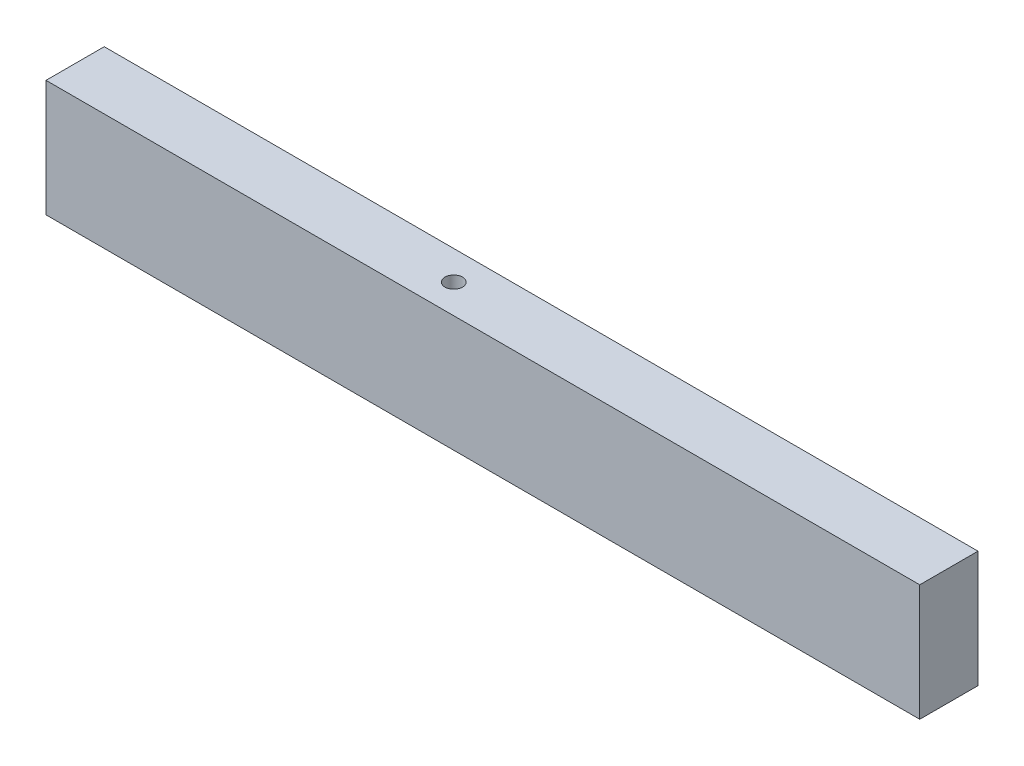
ISO-10303-21;
HEADER;
FILE_DESCRIPTION(('STEP AP214'),'2;1');
FILE_NAME('part.step','',(''),(''),'','','');
FILE_SCHEMA(('AUTOMOTIVE_DESIGN { 1 0 10303 214 1 1 1 1 }'));
ENDSEC;
DATA;
#1=APPLICATION_CONTEXT('core data for automotive mechanical design processes');
#2=APPLICATION_PROTOCOL_DEFINITION('international standard','automotive_design',2000,#1);
#3=PRODUCT_CONTEXT('',#1,'mechanical');
#4=PRODUCT('Part','Part','',(#3));
#5=PRODUCT_RELATED_PRODUCT_CATEGORY('part','',(#4));
#6=PRODUCT_DEFINITION_FORMATION('','',#4);
#7=PRODUCT_DEFINITION_CONTEXT('part definition',#1,'design');
#8=PRODUCT_DEFINITION('design','',#6,#7);
#9=PRODUCT_DEFINITION_SHAPE('','',#8);
#10=(LENGTH_UNIT() NAMED_UNIT(*) SI_UNIT(.MILLI.,.METRE.));
#11=(NAMED_UNIT(*) PLANE_ANGLE_UNIT() SI_UNIT($,.RADIAN.));
#12=(NAMED_UNIT(*) SI_UNIT($,.STERADIAN.) SOLID_ANGLE_UNIT());
#13=UNCERTAINTY_MEASURE_WITH_UNIT(LENGTH_MEASURE(1.E-05),#10,'distance_accuracy_value','');
#14=(GEOMETRIC_REPRESENTATION_CONTEXT(3) GLOBAL_UNCERTAINTY_ASSIGNED_CONTEXT((#13)) GLOBAL_UNIT_ASSIGNED_CONTEXT((#10,
#11,#12)) REPRESENTATION_CONTEXT('',''));
#15=CARTESIAN_POINT('',(0.,0.,0.));
#16=DIRECTION('',(0.,0.,1.));
#17=DIRECTION('',(1.,0.,0.));
#18=AXIS2_PLACEMENT_3D('',#15,#16,#17);
#19=CARTESIAN_POINT('',(300.,-20.,-10.));
#20=DIRECTION('',(0.,0.,1.));
#21=DIRECTION('',(1.,0.,0.));
#22=AXIS2_PLACEMENT_3D('',#19,#20,#21);
#23=PLANE('',#22);
#24=DIRECTION('',(0.,1.,0.));
#25=VECTOR('',#24,1.);
#26=CARTESIAN_POINT('',(0.,-20.,-10.));
#27=LINE('',#26,#25);
#28=CARTESIAN_POINT('',(0.,-20.,-10.));
#29=VERTEX_POINT('',#28);
#30=CARTESIAN_POINT('',(0.,20.,-10.));
#31=VERTEX_POINT('',#30);
#32=EDGE_CURVE('E96',#29,#31,#27,.T.);
#33=ORIENTED_EDGE('',*,*,#32,.T.);
#34=DIRECTION('',(-1.,0.,0.));
#35=VECTOR('',#34,1.);
#36=CARTESIAN_POINT('',(300.,20.,-10.));
#37=LINE('',#36,#35);
#38=CARTESIAN_POINT('',(300.,20.,-10.));
#39=VERTEX_POINT('',#38);
#40=EDGE_CURVE('E11',#39,#31,#37,.T.);
#41=ORIENTED_EDGE('',*,*,#40,.F.);
#42=DIRECTION('',(0.,1.,0.));
#43=VECTOR('',#42,1.);
#44=CARTESIAN_POINT('',(300.,-20.,-10.));
#45=LINE('',#44,#43);
#46=CARTESIAN_POINT('',(300.,-20.,-10.));
#47=VERTEX_POINT('',#46);
#48=EDGE_CURVE('E84',#47,#39,#45,.T.);
#49=ORIENTED_EDGE('',*,*,#48,.F.);
#50=DIRECTION('',(-1.,0.,0.));
#51=VECTOR('',#50,1.);
#52=CARTESIAN_POINT('',(300.,-20.,-10.));
#53=LINE('',#52,#51);
#54=EDGE_CURVE('E92',#47,#29,#53,.T.);
#55=ORIENTED_EDGE('',*,*,#54,.T.);
#56=EDGE_LOOP('',(#33,#41,#49,#55));
#57=FACE_BOUND('',#56,.T.);
#58=ADVANCED_FACE('F33',(#57),#23,.F.);
#59=CARTESIAN_POINT('',(300.,20.,10.));
#60=DIRECTION('',(0.,-1.,0.));
#61=DIRECTION('',(0.,0.,-1.));
#62=AXIS2_PLACEMENT_3D('',#59,#60,#61);
#63=PLANE('',#62);
#64=CARTESIAN_POINT('',(130.,20.,0.));
#65=DIRECTION('',(0.,1.,0.));
#66=DIRECTION('',(0.,0.,1.));
#67=AXIS2_PLACEMENT_3D('',#64,#65,#66);
#68=CIRCLE('',#67,2.99999999999999);
#69=CARTESIAN_POINT('',(130.,20.,2.99999999999999));
#70=VERTEX_POINT('',#69);
#71=EDGE_CURVE('E110',#70,#70,#68,.T.);
#72=ORIENTED_EDGE('',*,*,#71,.F.);
#73=EDGE_LOOP('',(#72));
#74=FACE_BOUND('',#73,.T.);
#75=DIRECTION('',(0.,0.,1.));
#76=VECTOR('',#75,1.);
#77=CARTESIAN_POINT('',(0.,20.,10.));
#78=LINE('',#77,#76);
#79=CARTESIAN_POINT('',(0.,20.,10.));
#80=VERTEX_POINT('',#79);
#81=EDGE_CURVE('E88',#31,#80,#78,.T.);
#82=ORIENTED_EDGE('',*,*,#81,.T.);
#83=DIRECTION('',(-1.,0.,0.));
#84=VECTOR('',#83,1.);
#85=CARTESIAN_POINT('',(300.,20.,10.));
#86=LINE('',#85,#84);
#87=CARTESIAN_POINT('',(300.,20.,10.));
#88=VERTEX_POINT('',#87);
#89=EDGE_CURVE('E41',#88,#80,#86,.T.);
#90=ORIENTED_EDGE('',*,*,#89,.F.);
#91=DIRECTION('',(0.,0.,1.));
#92=VECTOR('',#91,1.);
#93=CARTESIAN_POINT('',(300.,20.,10.));
#94=LINE('',#93,#92);
#95=EDGE_CURVE('E79',#39,#88,#94,.T.);
#96=ORIENTED_EDGE('',*,*,#95,.F.);
#97=ORIENTED_EDGE('',*,*,#40,.T.);
#98=EDGE_LOOP('',(#82,#90,#96,#97));
#99=FACE_BOUND('',#98,.T.);
#100=ADVANCED_FACE('F87',(#74,#99),#63,.F.);
#101=CARTESIAN_POINT('',(300.,-20.,10.));
#102=DIRECTION('',(0.,0.,-1.));
#103=DIRECTION('',(-1.,0.,0.));
#104=AXIS2_PLACEMENT_3D('',#101,#102,#103);
#105=PLANE('',#104);
#106=DIRECTION('',(0.,-1.,0.));
#107=VECTOR('',#106,1.);
#108=CARTESIAN_POINT('',(0.,-20.,10.));
#109=LINE('',#108,#107);
#110=CARTESIAN_POINT('',(0.,-20.,10.));
#111=VERTEX_POINT('',#110);
#112=EDGE_CURVE('E66',#80,#111,#109,.T.);
#113=ORIENTED_EDGE('',*,*,#112,.T.);
#114=DIRECTION('',(-1.,0.,0.));
#115=VECTOR('',#114,1.);
#116=CARTESIAN_POINT('',(300.,-20.,10.));
#117=LINE('',#116,#115);
#118=CARTESIAN_POINT('',(300.,-20.,10.));
#119=VERTEX_POINT('',#118);
#120=EDGE_CURVE('E89',#119,#111,#117,.T.);
#121=ORIENTED_EDGE('',*,*,#120,.F.);
#122=DIRECTION('',(0.,-1.,0.));
#123=VECTOR('',#122,1.);
#124=CARTESIAN_POINT('',(300.,-20.,10.));
#125=LINE('',#124,#123);
#126=EDGE_CURVE('E82',#88,#119,#125,.T.);
#127=ORIENTED_EDGE('',*,*,#126,.F.);
#128=ORIENTED_EDGE('',*,*,#89,.T.);
#129=EDGE_LOOP('',(#113,#121,#127,#128));
#130=FACE_BOUND('',#129,.T.);
#131=ADVANCED_FACE('F90',(#130),#105,.F.);
#132=CARTESIAN_POINT('',(300.,-20.,10.));
#133=DIRECTION('',(0.,1.,0.));
#134=DIRECTION('',(0.,0.,1.));
#135=AXIS2_PLACEMENT_3D('',#132,#133,#134);
#136=PLANE('',#135);
#137=CARTESIAN_POINT('',(130.,-20.,0.));
#138=DIRECTION('',(0.,1.,0.));
#139=DIRECTION('',(0.,0.,1.));
#140=AXIS2_PLACEMENT_3D('',#137,#138,#139);
#141=CIRCLE('',#140,2.99999999999999);
#142=CARTESIAN_POINT('',(130.,-20.,2.99999999999999));
#143=VERTEX_POINT('',#142);
#144=EDGE_CURVE('E99',#143,#143,#141,.T.);
#145=ORIENTED_EDGE('',*,*,#144,.T.);
#146=EDGE_LOOP('',(#145));
#147=FACE_BOUND('',#146,.T.);
#148=DIRECTION('',(0.,0.,-1.));
#149=VECTOR('',#148,1.);
#150=CARTESIAN_POINT('',(0.,-20.,10.));
#151=LINE('',#150,#149);
#152=EDGE_CURVE('E72',#111,#29,#151,.T.);
#153=ORIENTED_EDGE('',*,*,#152,.T.);
#154=ORIENTED_EDGE('',*,*,#54,.F.);
#155=DIRECTION('',(0.,0.,-1.));
#156=VECTOR('',#155,1.);
#157=CARTESIAN_POINT('',(300.,-20.,10.));
#158=LINE('',#157,#156);
#159=EDGE_CURVE('E49',#119,#47,#158,.T.);
#160=ORIENTED_EDGE('',*,*,#159,.F.);
#161=ORIENTED_EDGE('',*,*,#120,.T.);
#162=EDGE_LOOP('',(#153,#154,#160,#161));
#163=FACE_BOUND('',#162,.T.);
#164=ADVANCED_FACE('F104',(#147,#163),#136,.F.);
#165=CARTESIAN_POINT('',(300.,0.,0.));
#166=DIRECTION('',(-1.,0.,0.));
#167=DIRECTION('',(0.,0.,1.));
#168=AXIS2_PLACEMENT_3D('',#165,#166,#167);
#169=PLANE('',#168);
#170=ORIENTED_EDGE('',*,*,#48,.T.);
#171=ORIENTED_EDGE('',*,*,#95,.T.);
#172=ORIENTED_EDGE('',*,*,#126,.T.);
#173=ORIENTED_EDGE('',*,*,#159,.T.);
#174=EDGE_LOOP('',(#170,#171,#172,#173));
#175=FACE_BOUND('',#174,.T.);
#176=ADVANCED_FACE('F80',(#175),#169,.F.);
#177=CARTESIAN_POINT('',(0.,0.,0.));
#178=DIRECTION('',(-1.,0.,0.));
#179=DIRECTION('',(0.,0.,1.));
#180=AXIS2_PLACEMENT_3D('',#177,#178,#179);
#181=PLANE('',#180);
#182=ORIENTED_EDGE('',*,*,#32,.F.);
#183=ORIENTED_EDGE('',*,*,#152,.F.);
#184=ORIENTED_EDGE('',*,*,#112,.F.);
#185=ORIENTED_EDGE('',*,*,#81,.F.);
#186=EDGE_LOOP('',(#182,#183,#184,#185));
#187=FACE_BOUND('',#186,.T.);
#188=ADVANCED_FACE('F107',(#187),#181,.T.);
#189=CARTESIAN_POINT('',(130.,-20.,0.));
#190=DIRECTION('',(0.,1.,0.));
#191=DIRECTION('',(0.,0.,1.));
#192=AXIS2_PLACEMENT_3D('',#189,#190,#191);
#193=CYLINDRICAL_SURFACE('',#192,2.99999999999999);
#194=ORIENTED_EDGE('',*,*,#144,.F.);
#195=EDGE_LOOP('',(#194));
#196=FACE_BOUND('',#195,.T.);
#197=ORIENTED_EDGE('',*,*,#71,.T.);
#198=EDGE_LOOP('',(#197));
#199=FACE_BOUND('',#198,.T.);
#200=ADVANCED_FACE('F117',(#196,#199),#193,.F.);
#201=CLOSED_SHELL('',(#58,#100,#131,#164,#176,#188,#200));
#202=MANIFOLD_SOLID_BREP('B2',#201);
#203=ADVANCED_BREP_SHAPE_REPRESENTATION('',(#18,#202),#14);
#204=SHAPE_DEFINITION_REPRESENTATION(#9,#203);
ENDSEC;
END-ISO-10303-21;
